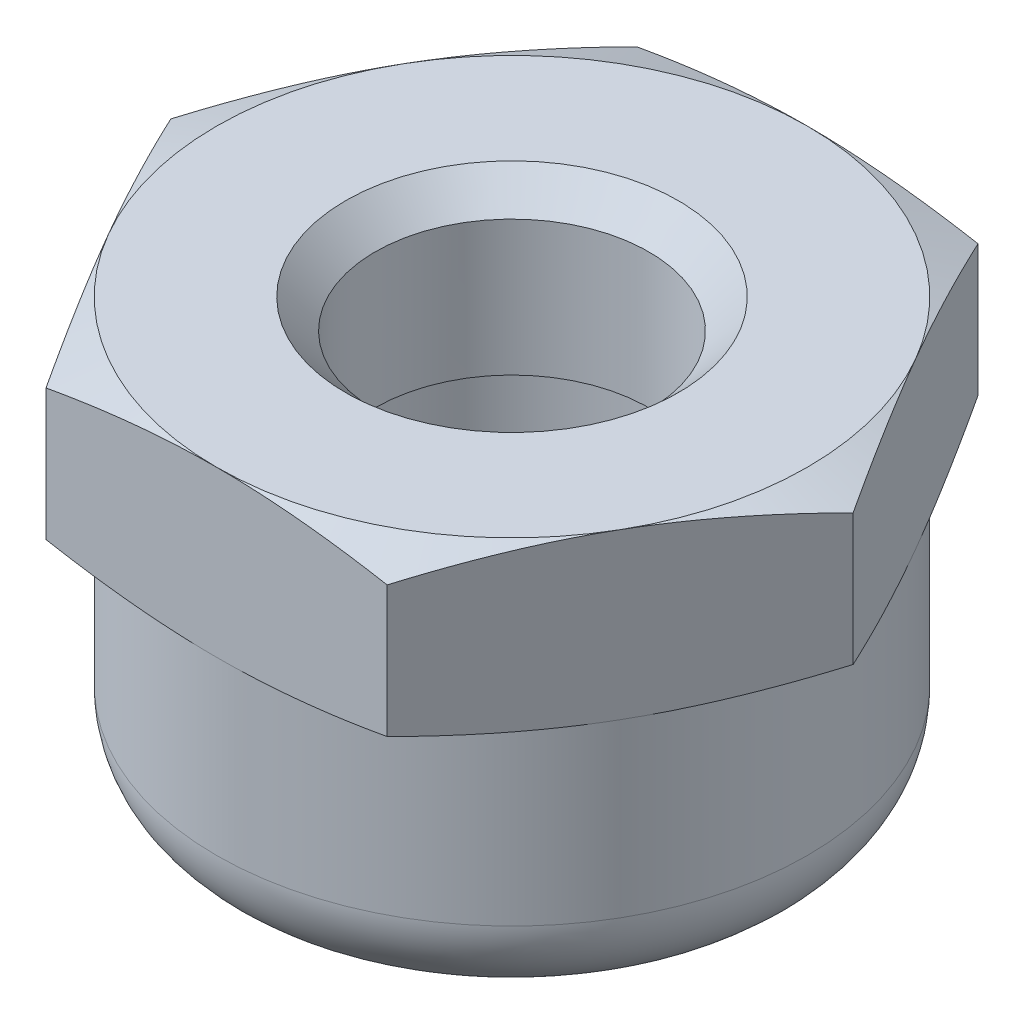
ISO-10303-21;
HEADER;
FILE_DESCRIPTION(('STEP AP214'),'2;1');
FILE_NAME('part.step','',(''),(''),'','','');
FILE_SCHEMA(('AUTOMOTIVE_DESIGN { 1 0 10303 214 1 1 1 1 }'));
ENDSEC;
DATA;
#1=APPLICATION_CONTEXT('core data for automotive mechanical design processes');
#2=APPLICATION_PROTOCOL_DEFINITION('international standard','automotive_design',2000,#1);
#3=PRODUCT_CONTEXT('',#1,'mechanical');
#4=PRODUCT('Part','Part','',(#3));
#5=PRODUCT_RELATED_PRODUCT_CATEGORY('part','',(#4));
#6=PRODUCT_DEFINITION_FORMATION('','',#4);
#7=PRODUCT_DEFINITION_CONTEXT('part definition',#1,'design');
#8=PRODUCT_DEFINITION('design','',#6,#7);
#9=PRODUCT_DEFINITION_SHAPE('','',#8);
#10=(LENGTH_UNIT() NAMED_UNIT(*) SI_UNIT(.MILLI.,.METRE.));
#11=(NAMED_UNIT(*) PLANE_ANGLE_UNIT() SI_UNIT($,.RADIAN.));
#12=(NAMED_UNIT(*) SI_UNIT($,.STERADIAN.) SOLID_ANGLE_UNIT());
#13=UNCERTAINTY_MEASURE_WITH_UNIT(LENGTH_MEASURE(1.E-05),#10,'distance_accuracy_value','');
#14=(GEOMETRIC_REPRESENTATION_CONTEXT(3) GLOBAL_UNCERTAINTY_ASSIGNED_CONTEXT((#13)) GLOBAL_UNIT_ASSIGNED_CONTEXT((#10,
#11,#12)) REPRESENTATION_CONTEXT('',''));
#15=CARTESIAN_POINT('',(0.,0.,0.));
#16=DIRECTION('',(0.,0.,1.));
#17=DIRECTION('',(1.,0.,0.));
#18=AXIS2_PLACEMENT_3D('',#15,#16,#17);
#19=CARTESIAN_POINT('',(0.,-6.18275648283159,0.));
#20=DIRECTION('',(0.,1.,0.));
#21=DIRECTION('',(-1.,0.,0.));
#22=AXIS2_PLACEMENT_3D('',#19,#20,#21);
#23=CYLINDRICAL_SURFACE('',#22,3.49999991495946);
#24=CARTESIAN_POINT('',(0.,-1.95,0.));
#25=DIRECTION('',(0.,1.,0.));
#26=DIRECTION('',(-1.,0.,0.));
#27=AXIS2_PLACEMENT_3D('',#24,#25,#26);
#28=CIRCLE('',#27,3.49999991495946);
#29=CARTESIAN_POINT('',(0.,-1.95,-3.49999991495946));
#30=VERTEX_POINT('',#29);
#31=CARTESIAN_POINT('',(-3.03108928221644,-1.95,-1.74999987218488));
#32=VERTEX_POINT('',#31);
#33=EDGE_CURVE('E439',#30,#32,#28,.T.);
#34=ORIENTED_EDGE('',*,*,#33,.F.);
#35=CARTESIAN_POINT('',(0.,-1.95,0.));
#36=DIRECTION('',(0.,1.,0.));
#37=DIRECTION('',(0.,0.,1.));
#38=AXIS2_PLACEMENT_3D('',#35,#36,#37);
#39=CIRCLE('',#38,3.49999991495946);
#40=CARTESIAN_POINT('',(3.0310886920098,-1.95,-1.75000021311043));
#41=VERTEX_POINT('',#40);
#42=EDGE_CURVE('E418',#41,#30,#39,.T.);
#43=ORIENTED_EDGE('',*,*,#42,.F.);
#44=CARTESIAN_POINT('',(0.,-1.95,0.));
#45=DIRECTION('',(0.,1.,0.));
#46=DIRECTION('',(0.,0.,1.));
#47=AXIS2_PLACEMENT_3D('',#44,#45,#46);
#48=CIRCLE('',#47,3.49999991495946);
#49=CARTESIAN_POINT('',(3.03108883945136,-1.95,1.75000063907637));
#50=VERTEX_POINT('',#49);
#51=EDGE_CURVE('E455',#50,#41,#48,.T.);
#52=ORIENTED_EDGE('',*,*,#51,.F.);
#53=CARTESIAN_POINT('',(0.,-1.95,0.));
#54=DIRECTION('',(0.,1.,0.));
#55=DIRECTION('',(0.,0.,1.));
#56=AXIS2_PLACEMENT_3D('',#53,#54,#55);
#57=CIRCLE('',#56,3.49999991495946);
#58=CARTESIAN_POINT('',(2.9517688299244E-07,-1.95,3.50000025563031));
#59=VERTEX_POINT('',#58);
#60=EDGE_CURVE('E1026',#59,#50,#57,.T.);
#61=ORIENTED_EDGE('',*,*,#60,.F.);
#62=CARTESIAN_POINT('',(0.,-1.95,0.));
#63=DIRECTION('',(0.,1.,0.));
#64=DIRECTION('',(0.,0.,1.));
#65=AXIS2_PLACEMENT_3D('',#62,#63,#64);
#66=CIRCLE('',#65,3.49999991495946);
#67=CARTESIAN_POINT('',(-3.03108942980477,-1.95,1.74999961655427));
#68=VERTEX_POINT('',#67);
#69=EDGE_CURVE('E195',#68,#59,#66,.T.);
#70=ORIENTED_EDGE('',*,*,#69,.F.);
#71=CARTESIAN_POINT('',(0.,-1.95,0.));
#72=DIRECTION('',(0.,1.,0.));
#73=DIRECTION('',(0.,0.,1.));
#74=AXIS2_PLACEMENT_3D('',#71,#72,#73);
#75=CIRCLE('',#74,3.49999991495946);
#76=EDGE_CURVE('E502',#32,#68,#75,.T.);
#77=ORIENTED_EDGE('',*,*,#76,.F.);
#78=EDGE_LOOP('',(#34,#43,#52,#61,#70,#77));
#79=FACE_BOUND('',#78,.T.);
#80=CARTESIAN_POINT('',(0.,-3.98333333333333,0.));
#81=DIRECTION('',(0.,1.,0.));
#82=DIRECTION('',(-1.,0.,0.));
#83=AXIS2_PLACEMENT_3D('',#80,#81,#82);
#84=CIRCLE('',#83,3.49999991495946);
#85=CARTESIAN_POINT('',(-3.49999991495946,-3.98333333333333,0.));
#86=VERTEX_POINT('',#85);
#87=EDGE_CURVE('E484',#86,#86,#84,.T.);
#88=ORIENTED_EDGE('',*,*,#87,.T.);
#89=EDGE_LOOP('',(#88));
#90=FACE_BOUND('',#89,.T.);
#91=ADVANCED_FACE('F15',(#79,#90),#23,.T.);
#92=CARTESIAN_POINT('',(0.,-6.18275648283159,0.));
#93=DIRECTION('',(0.,1.,0.));
#94=DIRECTION('',(-1.,0.,0.));
#95=AXIS2_PLACEMENT_3D('',#92,#93,#94);
#96=CYLINDRICAL_SURFACE('',#95,1.65);
#97=CARTESIAN_POINT('',(0.,-4.8,0.));
#98=DIRECTION('',(0.,1.,0.));
#99=DIRECTION('',(-1.,0.,0.));
#100=AXIS2_PLACEMENT_3D('',#97,#98,#99);
#101=CIRCLE('',#100,1.65);
#102=CARTESIAN_POINT('',(-1.65,-4.8,0.));
#103=VERTEX_POINT('',#102);
#104=EDGE_CURVE('E10',#103,#103,#101,.T.);
#105=ORIENTED_EDGE('',*,*,#104,.F.);
#106=EDGE_LOOP('',(#105));
#107=FACE_BOUND('',#106,.T.);
#108=CARTESIAN_POINT('',(0.,-1.95,0.));
#109=DIRECTION('',(0.,1.,0.));
#110=DIRECTION('',(-1.,0.,0.));
#111=AXIS2_PLACEMENT_3D('',#108,#109,#110);
#112=CIRCLE('',#111,1.65);
#113=CARTESIAN_POINT('',(-1.65,-1.95,0.));
#114=VERTEX_POINT('',#113);
#115=EDGE_CURVE('E261',#114,#114,#112,.T.);
#116=ORIENTED_EDGE('',*,*,#115,.T.);
#117=EDGE_LOOP('',(#116));
#118=FACE_BOUND('',#117,.T.);
#119=ADVANCED_FACE('F528',(#107,#118),#96,.F.);
#120=CARTESIAN_POINT('',(0.,-4.8,-1.65));
#121=DIRECTION('',(0.,-1.,0.));
#122=DIRECTION('',(-1.,0.,0.));
#123=AXIS2_PLACEMENT_3D('',#120,#121,#122);
#124=PLANE('',#123);
#125=CARTESIAN_POINT('',(0.,-4.8,0.));
#126=DIRECTION('',(0.,1.,0.));
#127=DIRECTION('',(-1.,0.,0.));
#128=AXIS2_PLACEMENT_3D('',#125,#126,#127);
#129=CIRCLE('',#128,2.1);
#130=CARTESIAN_POINT('',(-2.1,-4.8,0.));
#131=VERTEX_POINT('',#130);
#132=EDGE_CURVE('E29',#131,#131,#129,.T.);
#133=ORIENTED_EDGE('',*,*,#132,.F.);
#134=EDGE_LOOP('',(#133));
#135=FACE_BOUND('',#134,.T.);
#136=ORIENTED_EDGE('',*,*,#104,.T.);
#137=EDGE_LOOP('',(#136));
#138=FACE_BOUND('',#137,.T.);
#139=ADVANCED_FACE('F648',(#135,#138),#124,.T.);
#140=CARTESIAN_POINT('',(0.,-6.18275648283159,0.));
#141=DIRECTION('',(0.,1.,0.));
#142=DIRECTION('',(-1.,0.,0.));
#143=AXIS2_PLACEMENT_3D('',#140,#141,#142);
#144=CYLINDRICAL_SURFACE('',#143,2.1);
#145=CARTESIAN_POINT('',(0.,-5.,0.));
#146=DIRECTION('',(0.,1.,0.));
#147=DIRECTION('',(-1.,0.,0.));
#148=AXIS2_PLACEMENT_3D('',#145,#146,#147);
#149=CIRCLE('',#148,2.1);
#150=CARTESIAN_POINT('',(-2.1,-5.,0.));
#151=VERTEX_POINT('',#150);
#152=EDGE_CURVE('E623',#151,#151,#149,.T.);
#153=ORIENTED_EDGE('',*,*,#152,.F.);
#154=EDGE_LOOP('',(#153));
#155=FACE_BOUND('',#154,.T.);
#156=ORIENTED_EDGE('',*,*,#132,.T.);
#157=EDGE_LOOP('',(#156));
#158=FACE_BOUND('',#157,.T.);
#159=ADVANCED_FACE('F395',(#155,#158),#144,.F.);
#160=CARTESIAN_POINT('',(0.,-5.,-2.48333324829279));
#161=DIRECTION('',(0.,-1.,0.));
#162=DIRECTION('',(-1.,0.,0.));
#163=AXIS2_PLACEMENT_3D('',#160,#161,#162);
#164=PLANE('',#163);
#165=CARTESIAN_POINT('',(0.,-5.,0.));
#166=DIRECTION('',(0.,1.,0.));
#167=DIRECTION('',(-1.,0.,0.));
#168=AXIS2_PLACEMENT_3D('',#165,#166,#167);
#169=CIRCLE('',#168,2.48333324829279);
#170=CARTESIAN_POINT('',(-2.48333324829279,-5.,0.));
#171=VERTEX_POINT('',#170);
#172=EDGE_CURVE('E480',#171,#171,#169,.T.);
#173=ORIENTED_EDGE('',*,*,#172,.F.);
#174=EDGE_LOOP('',(#173));
#175=FACE_BOUND('',#174,.T.);
#176=ORIENTED_EDGE('',*,*,#152,.T.);
#177=EDGE_LOOP('',(#176));
#178=FACE_BOUND('',#177,.T.);
#179=ADVANCED_FACE('F301',(#175,#178),#164,.T.);
#180=CARTESIAN_POINT('',(0.,-3.98333333333333,0.));
#181=DIRECTION('',(0.,1.,0.));
#182=DIRECTION('',(-1.,0.,0.));
#183=AXIS2_PLACEMENT_3D('',#180,#181,#182);
#184=TOROIDAL_SURFACE('',#183,2.48333324829279,1.01666666666667);
#185=ORIENTED_EDGE('',*,*,#87,.F.);
#186=EDGE_LOOP('',(#185));
#187=FACE_BOUND('',#186,.T.);
#188=ORIENTED_EDGE('',*,*,#172,.T.);
#189=EDGE_LOOP('',(#188));
#190=FACE_BOUND('',#189,.T.);
#191=ADVANCED_FACE('F303',(#187,#190),#184,.T.);
#192=CARTESIAN_POINT('',(2.02072608975207,-1.95,-3.49999991479005));
#193=DIRECTION('',(-0.866025361616303,0.,0.500000073037347));
#194=DIRECTION('',(0.,1.,0.));
#195=AXIS2_PLACEMENT_3D('',#192,#193,#194);
#196=PLANE('',#195);
#197=DIRECTION('',(0.,1.,0.));
#198=VECTOR('',#197,1.);
#199=CARTESIAN_POINT('',(2.02072608975207,-1.95,-3.49999991479005));
#200=LINE('',#199,#198);
#201=CARTESIAN_POINT('',(2.02072608975207,-1.75292759986518,-3.49999991479005));
#202=VERTEX_POINT('',#201);
#203=CARTESIAN_POINT('',(2.02072608975207,-0.197072400134816,-3.49999991479005));
#204=VERTEX_POINT('',#203);
#205=EDGE_CURVE('E446',#202,#204,#200,.T.);
#206=ORIENTED_EDGE('',*,*,#205,.T.);
#207=CARTESIAN_POINT('',(2.02072608975207,-0.197072400134815,-3.49999991479005));
#208=CARTESIAN_POINT('',(2.56217791617985,-1.23994214852249E-07,-2.56217802422224));
#209=CARTESIAN_POINT('',(3.03108898703978,-1.23994214852249E-07,-1.75000038344612));
#210=B_SPLINE_CURVE_WITH_KNOTS('',2,(#207,#208,#209),.UNSPECIFIED.,.F.,.F.,(3,3),(0.,1.),.UNSPECIFIED.);
#211=CARTESIAN_POINT('',(3.0310886920098,0.,-1.75000021311043));
#212=VERTEX_POINT('',#211);
#213=EDGE_CURVE('E587',#204,#212,#210,.T.);
#214=ORIENTED_EDGE('',*,*,#213,.T.);
#215=CARTESIAN_POINT('',(3.03108898703978,-1.23994214852249E-07,-1.75000038344612));
#216=CARTESIAN_POINT('',(3.50000029517689,-1.23994214852249E-07,-0.937822331693953));
#217=CARTESIAN_POINT('',(4.04145247468113,-0.19707261500593,1.70420092534401E-07));
#218=B_SPLINE_CURVE_WITH_KNOTS('',2,(#215,#216,#217),.UNSPECIFIED.,.F.,.F.,(3,3),(0.,1.),.UNSPECIFIED.);
#219=CARTESIAN_POINT('',(4.04145247468112,-0.197072615005931,1.70420093938021E-07));
#220=VERTEX_POINT('',#219);
#221=EDGE_CURVE('E333',#212,#220,#218,.T.);
#222=ORIENTED_EDGE('',*,*,#221,.T.);
#223=DIRECTION('',(0.,1.,0.));
#224=VECTOR('',#223,1.);
#225=CARTESIAN_POINT('',(4.04145247468112,-1.95,1.70420094269125E-07));
#226=LINE('',#225,#224);
#227=CARTESIAN_POINT('',(4.04145247468112,-1.75292738499407,1.70420094067994E-07));
#228=VERTEX_POINT('',#227);
#229=EDGE_CURVE('E402',#228,#220,#226,.T.);
#230=ORIENTED_EDGE('',*,*,#229,.F.);
#231=CARTESIAN_POINT('',(4.04145247468113,-1.75292738499407,1.70420092534401E-07));
#232=CARTESIAN_POINT('',(3.50000029517689,-1.94999987600579,-0.937822331693957));
#233=CARTESIAN_POINT('',(3.03108898703978,-1.94999987600579,-1.75000038344612));
#234=B_SPLINE_CURVE_WITH_KNOTS('',2,(#231,#232,#233),.UNSPECIFIED.,.F.,.F.,(3,3),(0.,1.),.UNSPECIFIED.);
#235=EDGE_CURVE('E377',#228,#41,#234,.T.);
#236=ORIENTED_EDGE('',*,*,#235,.T.);
#237=CARTESIAN_POINT('',(3.03108898703979,-1.94999987600579,-1.75000038344611));
#238=CARTESIAN_POINT('',(2.56217791617986,-1.94999987600579,-2.56217802422223));
#239=CARTESIAN_POINT('',(2.02072608975207,-1.75292759986518,-3.49999991479005));
#240=B_SPLINE_CURVE_WITH_KNOTS('',2,(#237,#238,#239),.UNSPECIFIED.,.F.,.F.,(3,3),(0.,1.),.UNSPECIFIED.);
#241=EDGE_CURVE('E423',#41,#202,#240,.T.);
#242=ORIENTED_EDGE('',*,*,#241,.T.);
#243=EDGE_LOOP('',(#206,#214,#222,#230,#236,#242));
#244=FACE_BOUND('',#243,.T.);
#245=ADVANCED_FACE('F306',(#244),#196,.F.);
#246=CARTESIAN_POINT('',(-2.02072608975203,-1.95,-3.50000059647139));
#247=DIRECTION('',(-1.68672374920833E-07,0.,0.999999999999986));
#248=DIRECTION('',(0.,1.,0.));
#249=AXIS2_PLACEMENT_3D('',#246,#247,#248);
#250=PLANE('',#249);
#251=DIRECTION('',(0.,1.,0.));
#252=VECTOR('',#251,1.);
#253=CARTESIAN_POINT('',(-2.02072608975203,-1.95,-3.50000059647139));
#254=LINE('',#253,#252);
#255=CARTESIAN_POINT('',(-2.02072608975203,-1.75292738499414,-3.50000059647139));
#256=VERTEX_POINT('',#255);
#257=CARTESIAN_POINT('',(-2.02072608975203,-0.197072615005859,-3.50000059647139));
#258=VERTEX_POINT('',#257);
#259=EDGE_CURVE('E133',#256,#258,#254,.T.);
#260=ORIENTED_EDGE('',*,*,#259,.T.);
#261=CARTESIAN_POINT('',(-2.02072608975203,-0.19707261500586,-3.50000059647139));
#262=CARTESIAN_POINT('',(-0.937822218691789,-1.84006184855007E-07,-3.50000041381542));
#263=CARTESIAN_POINT('',(-2.49930878944149E-08,-1.23994199890259E-07,-3.50000025563073));
#264=B_SPLINE_CURVE_WITH_KNOTS('',2,(#261,#262,#263),.UNSPECIFIED.,.F.,.F.,(3,3),(0.,1.),.UNSPECIFIED.);
#265=CARTESIAN_POINT('',(0.,0.,-3.49999991495946));
#266=VERTEX_POINT('',#265);
#267=EDGE_CURVE('E595',#258,#266,#264,.T.);
#268=ORIENTED_EDGE('',*,*,#267,.T.);
#269=CARTESIAN_POINT('',(-2.49930878944149E-08,-1.23994199890259E-07,-3.50000025563073));
#270=CARTESIAN_POINT('',(0.937822265318074,-6.3982209938182E-08,-3.50000009744601));
#271=CARTESIAN_POINT('',(2.02072608975206,-0.197072400134815,-3.49999991479005));
#272=B_SPLINE_CURVE_WITH_KNOTS('',2,(#269,#270,#271),.UNSPECIFIED.,.F.,.F.,(3,3),(0.,1.),.UNSPECIFIED.);
#273=EDGE_CURVE('E432',#266,#204,#272,.T.);
#274=ORIENTED_EDGE('',*,*,#273,.T.);
#275=ORIENTED_EDGE('',*,*,#205,.F.);
#276=CARTESIAN_POINT('',(2.02072608975207,-1.75292759986518,-3.49999991479005));
#277=CARTESIAN_POINT('',(0.937822292105618,-1.94999993114286,-3.50000009744601));
#278=CARTESIAN_POINT('',(2.49932119271434E-08,-1.9499998760058,-3.50000025563072));
#279=B_SPLINE_CURVE_WITH_KNOTS('',2,(#276,#277,#278),.UNSPECIFIED.,.F.,.F.,(3,3),(0.,1.),.UNSPECIFIED.);
#280=EDGE_CURVE('E122',#202,#30,#279,.T.);
#281=ORIENTED_EDGE('',*,*,#280,.T.);
#282=CARTESIAN_POINT('',(2.4993206722973E-08,-1.9499998760058,-3.50000025563072));
#283=CARTESIAN_POINT('',(-0.937822191904217,-1.94999982086876,-3.50000041381542));
#284=CARTESIAN_POINT('',(-2.02072608975203,-1.75292738499414,-3.50000059647139));
#285=B_SPLINE_CURVE_WITH_KNOTS('',2,(#282,#283,#284),.UNSPECIFIED.,.F.,.F.,(3,3),(0.,1.),.UNSPECIFIED.);
#286=EDGE_CURVE('E444',#30,#256,#285,.T.);
#287=ORIENTED_EDGE('',*,*,#286,.T.);
#288=EDGE_LOOP('',(#260,#268,#274,#275,#281,#287));
#289=FACE_BOUND('',#288,.T.);
#290=ADVANCED_FACE('F344',(#289),#250,.F.);
#291=CARTESIAN_POINT('',(-4.04145188432759,-1.95,-1.70420397569611E-07));
#292=DIRECTION('',(0.866025445952517,0.,0.499999926962739));
#293=DIRECTION('',(0.,-1.,0.));
#294=AXIS2_PLACEMENT_3D('',#291,#292,#293);
#295=PLANE('',#294);
#296=DIRECTION('',(0.,1.,0.));
#297=VECTOR('',#296,1.);
#298=CARTESIAN_POINT('',(-4.04145188432759,-1.95,-1.70420397412052E-07));
#299=LINE('',#298,#297);
#300=CARTESIAN_POINT('',(-4.04145188432759,-1.75292759986518,-1.70420397432963E-07));
#301=VERTEX_POINT('',#300);
#302=CARTESIAN_POINT('',(-4.04145188432759,-0.197072400134816,-1.70420397411493E-07));
#303=VERTEX_POINT('',#302);
#304=EDGE_CURVE('E180',#301,#303,#299,.T.);
#305=ORIENTED_EDGE('',*,*,#304,.T.);
#306=CARTESIAN_POINT('',(-4.04145188432759,-0.197072400134815,-1.7042039752492E-07));
#307=CARTESIAN_POINT('',(-3.50000021608444,-1.23994164978949E-07,-0.93782215231631));
#308=CARTESIAN_POINT('',(-3.03108928221644,-1.23994164978949E-07,-1.74999987218487));
#309=B_SPLINE_CURVE_WITH_KNOTS('',2,(#306,#307,#308),.UNSPECIFIED.,.F.,.F.,(3,3),(0.,1.),.UNSPECIFIED.);
#310=CARTESIAN_POINT('',(-3.03108898718654,0.,-1.74999970184932));
#311=VERTEX_POINT('',#310);
#312=EDGE_CURVE('E275',#303,#311,#309,.T.);
#313=ORIENTED_EDGE('',*,*,#312,.T.);
#314=CARTESIAN_POINT('',(-3.03108928221644,-1.23994164978949E-07,-1.74999987218487));
#315=CARTESIAN_POINT('',(-2.56217811107142,-1.23994164978949E-07,-2.56217800302938));
#316=CARTESIAN_POINT('',(-2.02072608975203,-0.19707261500586,-3.50000059647139));
#317=B_SPLINE_CURVE_WITH_KNOTS('',2,(#314,#315,#316),.UNSPECIFIED.,.F.,.F.,(3,3),(0.,1.),.UNSPECIFIED.);
#318=EDGE_CURVE('E960',#311,#258,#317,.T.);
#319=ORIENTED_EDGE('',*,*,#318,.T.);
#320=ORIENTED_EDGE('',*,*,#259,.F.);
#321=CARTESIAN_POINT('',(-2.02072608975203,-1.75292738499414,-3.50000059647139));
#322=CARTESIAN_POINT('',(-2.56217811107141,-1.94999987600584,-2.56217800302939));
#323=CARTESIAN_POINT('',(-3.03108928221644,-1.94999987600584,-1.74999987218487));
#324=B_SPLINE_CURVE_WITH_KNOTS('',2,(#321,#322,#323),.UNSPECIFIED.,.F.,.F.,(3,3),(0.,1.),.UNSPECIFIED.);
#325=EDGE_CURVE('E443',#256,#32,#324,.T.);
#326=ORIENTED_EDGE('',*,*,#325,.T.);
#327=CARTESIAN_POINT('',(-3.03108928221644,-1.94999987600584,-1.74999987218487));
#328=CARTESIAN_POINT('',(-3.50000021608444,-1.94999987600584,-0.937822152316311));
#329=CARTESIAN_POINT('',(-4.04145188432759,-1.75292759986518,-1.70420398126614E-07));
#330=B_SPLINE_CURVE_WITH_KNOTS('',2,(#327,#328,#329),.UNSPECIFIED.,.F.,.F.,(3,3),(0.,1.),.UNSPECIFIED.);
#331=EDGE_CURVE('E507',#32,#301,#330,.T.);
#332=ORIENTED_EDGE('',*,*,#331,.T.);
#333=EDGE_LOOP('',(#305,#313,#319,#320,#326,#332));
#334=FACE_BOUND('',#333,.T.);
#335=ADVANCED_FACE('F17',(#334),#295,.F.);
#336=CARTESIAN_POINT('',(-2.0207263849289,-1.95,3.50000042605082));
#337=DIRECTION('',(0.866025488120614,0.,-0.49999985392543));
#338=DIRECTION('',(0.,-1.,0.));
#339=AXIS2_PLACEMENT_3D('',#336,#337,#338);
#340=PLANE('',#339);
#341=DIRECTION('',(0.,1.,0.));
#342=VECTOR('',#341,1.);
#343=CARTESIAN_POINT('',(-2.0207263849289,-1.95,3.50000042605082));
#344=LINE('',#343,#342);
#345=CARTESIAN_POINT('',(-2.0207263849289,-1.75292738499418,3.50000042605082));
#346=VERTEX_POINT('',#345);
#347=CARTESIAN_POINT('',(-2.0207263849289,-0.197072615005816,3.50000042605082));
#348=VERTEX_POINT('',#347);
#349=EDGE_CURVE('E166',#346,#348,#344,.T.);
#350=ORIENTED_EDGE('',*,*,#349,.T.);
#351=CARTESIAN_POINT('',(-2.0207263849289,-0.197072615005815,3.50000042605082));
#352=CARTESIAN_POINT('',(-2.56217832715582,-1.23994155004289E-07,2.56217778694489));
#353=CARTESIAN_POINT('',(-3.03108942980477,-1.23994155004289E-07,1.74999961655427));
#354=B_SPLINE_CURVE_WITH_KNOTS('',2,(#351,#352,#353),.UNSPECIFIED.,.F.,.F.,(3,3),(0.,1.),.UNSPECIFIED.);
#355=CARTESIAN_POINT('',(-3.03108913477487,0.,1.74999944621875));
#356=VERTEX_POINT('',#355);
#357=EDGE_CURVE('E171',#348,#356,#354,.T.);
#358=ORIENTED_EDGE('',*,*,#357,.T.);
#359=CARTESIAN_POINT('',(-3.03108942980477,-1.23994155004289E-07,1.74999961655427));
#360=CARTESIAN_POINT('',(-3.50000029517679,-1.23994155004289E-07,0.937821857139521));
#361=CARTESIAN_POINT('',(-4.04145188432759,-0.197072400134815,-1.70420393508924E-07));
#362=B_SPLINE_CURVE_WITH_KNOTS('',2,(#359,#360,#361),.UNSPECIFIED.,.F.,.F.,(3,3),(0.,1.),.UNSPECIFIED.);
#363=EDGE_CURVE('E878',#356,#303,#362,.T.);
#364=ORIENTED_EDGE('',*,*,#363,.T.);
#365=ORIENTED_EDGE('',*,*,#304,.F.);
#366=CARTESIAN_POINT('',(-4.04145188432759,-1.75292759986518,-1.70420393508924E-07));
#367=CARTESIAN_POINT('',(-3.50000029517679,-1.94999987600584,0.937821857139521));
#368=CARTESIAN_POINT('',(-3.03108942980477,-1.94999987600584,1.74999961655427));
#369=B_SPLINE_CURVE_WITH_KNOTS('',2,(#366,#367,#368),.UNSPECIFIED.,.F.,.F.,(3,3),(0.,1.),.UNSPECIFIED.);
#370=EDGE_CURVE('E506',#301,#68,#369,.T.);
#371=ORIENTED_EDGE('',*,*,#370,.T.);
#372=CARTESIAN_POINT('',(-3.03108942980477,-1.94999987600584,1.74999961655427));
#373=CARTESIAN_POINT('',(-2.5621783271558,-1.94999987600584,2.56217778694493));
#374=CARTESIAN_POINT('',(-2.0207263849289,-1.75292738499418,3.50000042605082));
#375=B_SPLINE_CURVE_WITH_KNOTS('',2,(#372,#373,#374),.UNSPECIFIED.,.F.,.F.,(3,3),(0.,1.),.UNSPECIFIED.);
#376=EDGE_CURVE('E175',#68,#346,#375,.T.);
#377=ORIENTED_EDGE('',*,*,#376,.T.);
#378=EDGE_LOOP('',(#350,#358,#364,#365,#371,#377));
#379=FACE_BOUND('',#378,.T.);
#380=ADVANCED_FACE('F168',(#379),#340,.F.);
#381=CARTESIAN_POINT('',(2.02072579457561,-1.95,3.50000008520991));
#382=DIRECTION('',(-8.43362461579822E-08,0.,-1.));
#383=DIRECTION('',(-1.,0.,8.43362461579822E-08));
#384=AXIS2_PLACEMENT_3D('',#381,#382,#383);
#385=PLANE('',#384);
#386=DIRECTION('',(0.,1.,0.));
#387=VECTOR('',#386,1.);
#388=CARTESIAN_POINT('',(2.02072579457561,-1.95,3.50000008520991));
#389=LINE('',#388,#387);
#390=CARTESIAN_POINT('',(2.02072579457561,-1.7529275998653,3.50000008520991));
#391=VERTEX_POINT('',#390);
#392=CARTESIAN_POINT('',(2.02072579457561,-0.197072400134705,3.50000008520991));
#393=VERTEX_POINT('',#392);
#394=EDGE_CURVE('E181',#391,#393,#389,.T.);
#395=ORIENTED_EDGE('',*,*,#394,.T.);
#396=CARTESIAN_POINT('',(2.02072579457561,-0.197072400134692,3.50000008520991));
#397=CARTESIAN_POINT('',(0.93782231329852,-1.26431506106486E-07,3.50000017653793));
#398=CARTESIAN_POINT('',(3.20169999887265E-07,-1.23994041163061E-07,3.50000025563031));
#399=B_SPLINE_CURVE_WITH_KNOTS('',2,(#396,#397,#398),.UNSPECIFIED.,.F.,.F.,(3,3),(0.,1.),.UNSPECIFIED.);
#400=CARTESIAN_POINT('',(2.9517688305214E-07,0.,3.50000025563031));
#401=VERTEX_POINT('',#400);
#402=EDGE_CURVE('E188',#393,#401,#399,.T.);
#403=ORIENTED_EDGE('',*,*,#402,.T.);
#404=CARTESIAN_POINT('',(3.20169994683095E-07,-1.23994041163061E-07,3.50000025563031));
#405=CARTESIAN_POINT('',(-0.93782217071146,-1.21556571015466E-07,3.50000033472274));
#406=CARTESIAN_POINT('',(-2.02072638492892,-0.197072615005803,3.50000042605082));
#407=B_SPLINE_CURVE_WITH_KNOTS('',2,(#404,#405,#406),.UNSPECIFIED.,.F.,.F.,(3,3),(0.,1.),.UNSPECIFIED.);
#408=EDGE_CURVE('E184',#401,#348,#407,.T.);
#409=ORIENTED_EDGE('',*,*,#408,.T.);
#410=ORIENTED_EDGE('',*,*,#349,.F.);
#411=CARTESIAN_POINT('',(-2.02072638492892,-1.75292738499418,3.50000042605082));
#412=CARTESIAN_POINT('',(-0.937822197499035,-1.94999987356847,3.50000033472274));
#413=CARTESIAN_POINT('',(2.70183759479986E-07,-1.94999987600595,3.50000025563032));
#414=B_SPLINE_CURVE_WITH_KNOTS('',2,(#411,#412,#413),.UNSPECIFIED.,.F.,.F.,(3,3),(0.,1.),.UNSPECIFIED.);
#415=EDGE_CURVE('E912',#346,#59,#414,.T.);
#416=ORIENTED_EDGE('',*,*,#415,.T.);
#417=CARTESIAN_POINT('',(2.70183759479986E-07,-1.94999987600595,3.50000025563032));
#418=CARTESIAN_POINT('',(0.937822286510984,-1.94999987844341,3.50000017653793));
#419=CARTESIAN_POINT('',(2.02072579457561,-1.7529275998653,3.50000008520991));
#420=B_SPLINE_CURVE_WITH_KNOTS('',2,(#417,#418,#419),.UNSPECIFIED.,.F.,.F.,(3,3),(0.,1.),.UNSPECIFIED.);
#421=EDGE_CURVE('E1092',#59,#391,#420,.T.);
#422=ORIENTED_EDGE('',*,*,#421,.T.);
#423=EDGE_LOOP('',(#395,#403,#409,#410,#416,#422));
#424=FACE_BOUND('',#423,.T.);
#425=ADVANCED_FACE('F186',(#424),#385,.F.);
#426=CARTESIAN_POINT('',(4.04145247468112,-1.95,1.70420094269125E-07));
#427=DIRECTION('',(-0.866025319448224,0.,-0.50000014607458));
#428=DIRECTION('',(-0.50000014607458,0.,0.866025319448224));
#429=AXIS2_PLACEMENT_3D('',#426,#427,#428);
#430=PLANE('',#429);
#431=ORIENTED_EDGE('',*,*,#229,.T.);
#432=CARTESIAN_POINT('',(4.04145247468112,-0.19707261500593,1.70420094049563E-07));
#433=CARTESIAN_POINT('',(3.50000021608448,-1.2399415543797E-07,0.937822626870294));
#434=CARTESIAN_POINT('',(3.03108883945136,-1.2399415543797E-07,1.75000063907638));
#435=B_SPLINE_CURVE_WITH_KNOTS('',2,(#432,#433,#434),.UNSPECIFIED.,.F.,.F.,(3,3),(0.,1.),.UNSPECIFIED.);
#436=CARTESIAN_POINT('',(3.03108854442152,0.,1.75000046874075));
#437=VERTEX_POINT('',#436);
#438=EDGE_CURVE('E605',#220,#437,#435,.T.);
#439=ORIENTED_EDGE('',*,*,#438,.T.);
#440=CARTESIAN_POINT('',(3.03108883945136,-1.2399415543797E-07,1.75000063907638));
#441=CARTESIAN_POINT('',(2.56217770009556,-1.2399415543797E-07,2.56217824030624));
#442=CARTESIAN_POINT('',(2.02072579457561,-0.197072400134705,3.50000008520991));
#443=B_SPLINE_CURVE_WITH_KNOTS('',2,(#440,#441,#442),.UNSPECIFIED.,.F.,.F.,(3,3),(0.,1.),.UNSPECIFIED.);
#444=EDGE_CURVE('E1024',#437,#393,#443,.T.);
#445=ORIENTED_EDGE('',*,*,#444,.T.);
#446=ORIENTED_EDGE('',*,*,#394,.F.);
#447=CARTESIAN_POINT('',(2.02072579457561,-1.7529275998653,3.50000008520991));
#448=CARTESIAN_POINT('',(2.56217770009556,-1.94999987600584,2.56217824030624));
#449=CARTESIAN_POINT('',(3.03108883945136,-1.94999987600584,1.75000063907638));
#450=B_SPLINE_CURVE_WITH_KNOTS('',2,(#447,#448,#449),.UNSPECIFIED.,.F.,.F.,(3,3),(0.,1.),.UNSPECIFIED.);
#451=EDGE_CURVE('E1030',#391,#50,#450,.T.);
#452=ORIENTED_EDGE('',*,*,#451,.T.);
#453=CARTESIAN_POINT('',(3.03108883945136,-1.94999987600584,1.75000063907638));
#454=CARTESIAN_POINT('',(3.50000021608448,-1.94999987600584,0.937822626870284));
#455=CARTESIAN_POINT('',(4.04145247468112,-1.75292738499407,1.70420093855996E-07));
#456=B_SPLINE_CURVE_WITH_KNOTS('',2,(#453,#454,#455),.UNSPECIFIED.,.F.,.F.,(3,3),(0.,1.),.UNSPECIFIED.);
#457=EDGE_CURVE('E203',#50,#228,#456,.T.);
#458=ORIENTED_EDGE('',*,*,#457,.T.);
#459=EDGE_LOOP('',(#431,#439,#445,#446,#452,#458));
#460=FACE_BOUND('',#459,.T.);
#461=ADVANCED_FACE('F466',(#460),#430,.F.);
#462=CARTESIAN_POINT('',(0.,-1.95,0.));
#463=DIRECTION('',(0.,1.,0.));
#464=DIRECTION('',(-1.,0.,0.));
#465=AXIS2_PLACEMENT_3D('',#462,#463,#464);
#466=CONICAL_SURFACE('',#465,3.49999991495946,1.22173047639603);
#467=ORIENTED_EDGE('',*,*,#241,.F.);
#468=ORIENTED_EDGE('',*,*,#42,.T.);
#469=ORIENTED_EDGE('',*,*,#280,.F.);
#470=EDGE_LOOP('',(#467,#468,#469));
#471=FACE_BOUND('',#470,.T.);
#472=ADVANCED_FACE('F449',(#471),#466,.T.);
#473=CARTESIAN_POINT('',(0.,-0.975,0.));
#474=DIRECTION('',(0.,-1.,0.));
#475=DIRECTION('',(1.,0.,0.));
#476=AXIS2_PLACEMENT_3D('',#473,#474,#475);
#477=CONICAL_SURFACE('',#476,6.17879039892772,1.22173047639603);
#478=CARTESIAN_POINT('',(0.,0.,0.));
#479=DIRECTION('',(0.,-1.,0.));
#480=DIRECTION('',(0.,0.,1.));
#481=AXIS2_PLACEMENT_3D('',#478,#479,#480);
#482=CIRCLE('',#481,3.49999991495946);
#483=EDGE_CURVE('E252',#266,#212,#482,.T.);
#484=ORIENTED_EDGE('',*,*,#483,.T.);
#485=ORIENTED_EDGE('',*,*,#213,.F.);
#486=ORIENTED_EDGE('',*,*,#273,.F.);
#487=EDGE_LOOP('',(#484,#485,#486));
#488=FACE_BOUND('',#487,.T.);
#489=ADVANCED_FACE('F465',(#488),#477,.T.);
#490=CARTESIAN_POINT('',(0.,-1.95,0.));
#491=DIRECTION('',(0.,1.,0.));
#492=DIRECTION('',(-1.,0.,0.));
#493=AXIS2_PLACEMENT_3D('',#490,#491,#492);
#494=CONICAL_SURFACE('',#493,3.49999991495946,1.22173047639603);
#495=ORIENTED_EDGE('',*,*,#286,.F.);
#496=ORIENTED_EDGE('',*,*,#33,.T.);
#497=ORIENTED_EDGE('',*,*,#325,.F.);
#498=EDGE_LOOP('',(#495,#496,#497));
#499=FACE_BOUND('',#498,.T.);
#500=ADVANCED_FACE('F562',(#499),#494,.T.);
#501=CARTESIAN_POINT('',(0.,-0.975,0.));
#502=DIRECTION('',(0.,-1.,0.));
#503=DIRECTION('',(1.,0.,0.));
#504=AXIS2_PLACEMENT_3D('',#501,#502,#503);
#505=CONICAL_SURFACE('',#504,6.17879039892772,1.22173047639603);
#506=CARTESIAN_POINT('',(0.,0.,0.));
#507=DIRECTION('',(0.,1.,0.));
#508=DIRECTION('',(-1.,0.,0.));
#509=AXIS2_PLACEMENT_3D('',#506,#507,#508);
#510=CIRCLE('',#509,3.49999991495946);
#511=EDGE_CURVE('E552',#266,#311,#510,.T.);
#512=ORIENTED_EDGE('',*,*,#511,.F.);
#513=ORIENTED_EDGE('',*,*,#267,.F.);
#514=ORIENTED_EDGE('',*,*,#318,.F.);
#515=EDGE_LOOP('',(#512,#513,#514));
#516=FACE_BOUND('',#515,.T.);
#517=ADVANCED_FACE('F345',(#516),#505,.T.);
#518=CARTESIAN_POINT('',(0.,-1.95,0.));
#519=DIRECTION('',(0.,1.,0.));
#520=DIRECTION('',(-1.,0.,0.));
#521=AXIS2_PLACEMENT_3D('',#518,#519,#520);
#522=CONICAL_SURFACE('',#521,3.49999991495946,1.22173047639603);
#523=ORIENTED_EDGE('',*,*,#331,.F.);
#524=ORIENTED_EDGE('',*,*,#76,.T.);
#525=ORIENTED_EDGE('',*,*,#370,.F.);
#526=EDGE_LOOP('',(#523,#524,#525));
#527=FACE_BOUND('',#526,.T.);
#528=ADVANCED_FACE('F300',(#527),#522,.T.);
#529=CARTESIAN_POINT('',(0.,-0.975,0.));
#530=DIRECTION('',(0.,-1.,0.));
#531=DIRECTION('',(1.,0.,0.));
#532=AXIS2_PLACEMENT_3D('',#529,#530,#531);
#533=CONICAL_SURFACE('',#532,6.17879039892772,1.22173047639603);
#534=CARTESIAN_POINT('',(0.,0.,0.));
#535=DIRECTION('',(0.,-1.,0.));
#536=DIRECTION('',(0.,0.,1.));
#537=AXIS2_PLACEMENT_3D('',#534,#535,#536);
#538=CIRCLE('',#537,3.49999991495946);
#539=EDGE_CURVE('E612',#356,#311,#538,.T.);
#540=ORIENTED_EDGE('',*,*,#539,.T.);
#541=ORIENTED_EDGE('',*,*,#312,.F.);
#542=ORIENTED_EDGE('',*,*,#363,.F.);
#543=EDGE_LOOP('',(#540,#541,#542));
#544=FACE_BOUND('',#543,.T.);
#545=ADVANCED_FACE('F290',(#544),#533,.T.);
#546=CARTESIAN_POINT('',(0.,-1.95,0.));
#547=DIRECTION('',(0.,1.,0.));
#548=DIRECTION('',(-1.,0.,0.));
#549=AXIS2_PLACEMENT_3D('',#546,#547,#548);
#550=CONICAL_SURFACE('',#549,3.49999991495946,1.22173047639603);
#551=ORIENTED_EDGE('',*,*,#69,.T.);
#552=ORIENTED_EDGE('',*,*,#415,.F.);
#553=ORIENTED_EDGE('',*,*,#376,.F.);
#554=EDGE_LOOP('',(#551,#552,#553));
#555=FACE_BOUND('',#554,.T.);
#556=ADVANCED_FACE('F225',(#555),#550,.T.);
#557=CARTESIAN_POINT('',(0.,-0.975,0.));
#558=DIRECTION('',(0.,-1.,0.));
#559=DIRECTION('',(1.,0.,0.));
#560=AXIS2_PLACEMENT_3D('',#557,#558,#559);
#561=CONICAL_SURFACE('',#560,6.17879039892772,1.22173047639603);
#562=CARTESIAN_POINT('',(0.,0.,0.));
#563=DIRECTION('',(0.,-1.,0.));
#564=DIRECTION('',(0.,0.,1.));
#565=AXIS2_PLACEMENT_3D('',#562,#563,#564);
#566=CIRCLE('',#565,3.49999991495946);
#567=EDGE_CURVE('E201',#401,#356,#566,.T.);
#568=ORIENTED_EDGE('',*,*,#567,.T.);
#569=ORIENTED_EDGE('',*,*,#357,.F.);
#570=ORIENTED_EDGE('',*,*,#408,.F.);
#571=EDGE_LOOP('',(#568,#569,#570));
#572=FACE_BOUND('',#571,.T.);
#573=ADVANCED_FACE('F199',(#572),#561,.T.);
#574=CARTESIAN_POINT('',(0.,-1.95,0.));
#575=DIRECTION('',(0.,1.,0.));
#576=DIRECTION('',(-1.,0.,0.));
#577=AXIS2_PLACEMENT_3D('',#574,#575,#576);
#578=CONICAL_SURFACE('',#577,3.49999991495946,1.22173047639603);
#579=ORIENTED_EDGE('',*,*,#51,.T.);
#580=ORIENTED_EDGE('',*,*,#235,.F.);
#581=ORIENTED_EDGE('',*,*,#457,.F.);
#582=EDGE_LOOP('',(#579,#580,#581));
#583=FACE_BOUND('',#582,.T.);
#584=ADVANCED_FACE('F224',(#583),#578,.T.);
#585=CARTESIAN_POINT('',(0.,-1.95,0.));
#586=DIRECTION('',(0.,1.,0.));
#587=DIRECTION('',(-1.,0.,0.));
#588=AXIS2_PLACEMENT_3D('',#585,#586,#587);
#589=CONICAL_SURFACE('',#588,3.49999991495946,1.22173047639603);
#590=ORIENTED_EDGE('',*,*,#60,.T.);
#591=ORIENTED_EDGE('',*,*,#451,.F.);
#592=ORIENTED_EDGE('',*,*,#421,.F.);
#593=EDGE_LOOP('',(#590,#591,#592));
#594=FACE_BOUND('',#593,.T.);
#595=ADVANCED_FACE('F392',(#594),#589,.T.);
#596=CARTESIAN_POINT('',(0.,-0.975,0.));
#597=DIRECTION('',(0.,-1.,0.));
#598=DIRECTION('',(1.,0.,0.));
#599=AXIS2_PLACEMENT_3D('',#596,#597,#598);
#600=CONICAL_SURFACE('',#599,6.17879039892772,1.22173047639603);
#601=CARTESIAN_POINT('',(0.,0.,0.));
#602=DIRECTION('',(0.,-1.,0.));
#603=DIRECTION('',(0.,0.,1.));
#604=AXIS2_PLACEMENT_3D('',#601,#602,#603);
#605=CIRCLE('',#604,3.49999991495946);
#606=EDGE_CURVE('E235',#437,#401,#605,.T.);
#607=ORIENTED_EDGE('',*,*,#606,.T.);
#608=ORIENTED_EDGE('',*,*,#402,.F.);
#609=ORIENTED_EDGE('',*,*,#444,.F.);
#610=EDGE_LOOP('',(#607,#608,#609));
#611=FACE_BOUND('',#610,.T.);
#612=ADVANCED_FACE('F312',(#611),#600,.T.);
#613=CARTESIAN_POINT('',(0.,-0.975,0.));
#614=DIRECTION('',(0.,-1.,0.));
#615=DIRECTION('',(1.,0.,0.));
#616=AXIS2_PLACEMENT_3D('',#613,#614,#615);
#617=CONICAL_SURFACE('',#616,6.17879039892772,1.22173047639603);
#618=ORIENTED_EDGE('',*,*,#221,.F.);
#619=CARTESIAN_POINT('',(0.,0.,0.));
#620=DIRECTION('',(0.,-1.,0.));
#621=DIRECTION('',(0.,0.,1.));
#622=AXIS2_PLACEMENT_3D('',#619,#620,#621);
#623=CIRCLE('',#622,3.49999991495946);
#624=EDGE_CURVE('E243',#212,#437,#623,.T.);
#625=ORIENTED_EDGE('',*,*,#624,.T.);
#626=ORIENTED_EDGE('',*,*,#438,.F.);
#627=EDGE_LOOP('',(#618,#625,#626));
#628=FACE_BOUND('',#627,.T.);
#629=ADVANCED_FACE('F308',(#628),#617,.T.);
#630=CARTESIAN_POINT('',(0.,0.,0.));
#631=DIRECTION('',(0.,1.,0.));
#632=DIRECTION('',(0.499999854216112,0.,0.866025487952789));
#633=AXIS2_PLACEMENT_3D('',#630,#631,#632);
#634=CONICAL_SURFACE('',#633,1.971,0.785398163397448);
#635=CARTESIAN_POINT('',(0.,-0.35,0.));
#636=DIRECTION('',(0.,1.,0.));
#637=DIRECTION('',(0.,0.,1.));
#638=AXIS2_PLACEMENT_3D('',#635,#636,#637);
#639=CIRCLE('',#638,1.621);
#640=CARTESIAN_POINT('',(0.,-0.35,1.621));
#641=VERTEX_POINT('',#640);
#642=EDGE_CURVE('E607',#641,#641,#639,.T.);
#643=ORIENTED_EDGE('',*,*,#642,.F.);
#644=EDGE_LOOP('',(#643));
#645=FACE_BOUND('',#644,.T.);
#646=CARTESIAN_POINT('',(0.,0.,0.));
#647=DIRECTION('',(0.,-1.,0.));
#648=DIRECTION('',(0.499999854216112,0.,0.866025487952789));
#649=AXIS2_PLACEMENT_3D('',#646,#647,#648);
#650=CIRCLE('',#649,1.971);
#651=CARTESIAN_POINT('',(0.98549971265996,0.,1.70693623675495));
#652=VERTEX_POINT('',#651);
#653=EDGE_CURVE('E255',#652,#652,#650,.T.);
#654=ORIENTED_EDGE('',*,*,#653,.F.);
#655=EDGE_LOOP('',(#654));
#656=FACE_BOUND('',#655,.T.);
#657=ADVANCED_FACE('F311',(#645,#656),#634,.F.);
#658=CARTESIAN_POINT('',(0.,8.91903202645912,0.));
#659=DIRECTION('',(0.,-1.,0.));
#660=DIRECTION('',(0.,0.,-1.));
#661=AXIS2_PLACEMENT_3D('',#658,#659,#660);
#662=CYLINDRICAL_SURFACE('',#661,1.621);
#663=CARTESIAN_POINT('',(0.,-1.95,0.));
#664=DIRECTION('',(0.,-1.,0.));
#665=DIRECTION('',(0.499999854216112,0.,0.866025487952789));
#666=AXIS2_PLACEMENT_3D('',#663,#664,#665);
#667=CIRCLE('',#666,1.621);
#668=CARTESIAN_POINT('',(0.810499763684321,-1.95,1.40382731597147));
#669=VERTEX_POINT('',#668);
#670=EDGE_CURVE('E627',#669,#669,#667,.T.);
#671=ORIENTED_EDGE('',*,*,#670,.T.);
#672=EDGE_LOOP('',(#671));
#673=FACE_BOUND('',#672,.T.);
#674=ORIENTED_EDGE('',*,*,#642,.T.);
#675=EDGE_LOOP('',(#674));
#676=FACE_BOUND('',#675,.T.);
#677=ADVANCED_FACE('F634',(#673,#676),#662,.F.);
#678=CARTESIAN_POINT('',(0.,0.,0.));
#679=DIRECTION('',(0.,1.,0.));
#680=DIRECTION('',(1.,0.,0.));
#681=AXIS2_PLACEMENT_3D('',#678,#679,#680);
#682=PLANE('',#681);
#683=ORIENTED_EDGE('',*,*,#567,.F.);
#684=ORIENTED_EDGE('',*,*,#606,.F.);
#685=ORIENTED_EDGE('',*,*,#624,.F.);
#686=ORIENTED_EDGE('',*,*,#483,.F.);
#687=ORIENTED_EDGE('',*,*,#511,.T.);
#688=ORIENTED_EDGE('',*,*,#539,.F.);
#689=EDGE_LOOP('',(#683,#684,#685,#686,#687,#688));
#690=FACE_BOUND('',#689,.T.);
#691=ORIENTED_EDGE('',*,*,#653,.T.);
#692=EDGE_LOOP('',(#691));
#693=FACE_BOUND('',#692,.T.);
#694=ADVANCED_FACE('F226',(#690,#693),#682,.T.);
#695=CARTESIAN_POINT('',(0.,-1.95,0.));
#696=DIRECTION('',(0.,1.,0.));
#697=DIRECTION('',(1.,0.,0.));
#698=AXIS2_PLACEMENT_3D('',#695,#696,#697);
#699=PLANE('',#698);
#700=ORIENTED_EDGE('',*,*,#115,.F.);
#701=EDGE_LOOP('',(#700));
#702=FACE_BOUND('',#701,.T.);
#703=ORIENTED_EDGE('',*,*,#670,.F.);
#704=EDGE_LOOP('',(#703));
#705=FACE_BOUND('',#704,.T.);
#706=ADVANCED_FACE('F467',(#702,#705),#699,.F.);
#707=CLOSED_SHELL('',(#91,#119,#139,#159,#179,#191,#245,#290,#335,#380,#425,#461,#472,#489,#500,
#517,#528,#545,#556,#573,#584,#595,#612,#629,#657,#677,#694,#706));
#708=MANIFOLD_SOLID_BREP('B1',#707);
#709=ADVANCED_BREP_SHAPE_REPRESENTATION('',(#18,#708),#14);
#710=SHAPE_DEFINITION_REPRESENTATION(#9,#709);
ENDSEC;
END-ISO-10303-21;
